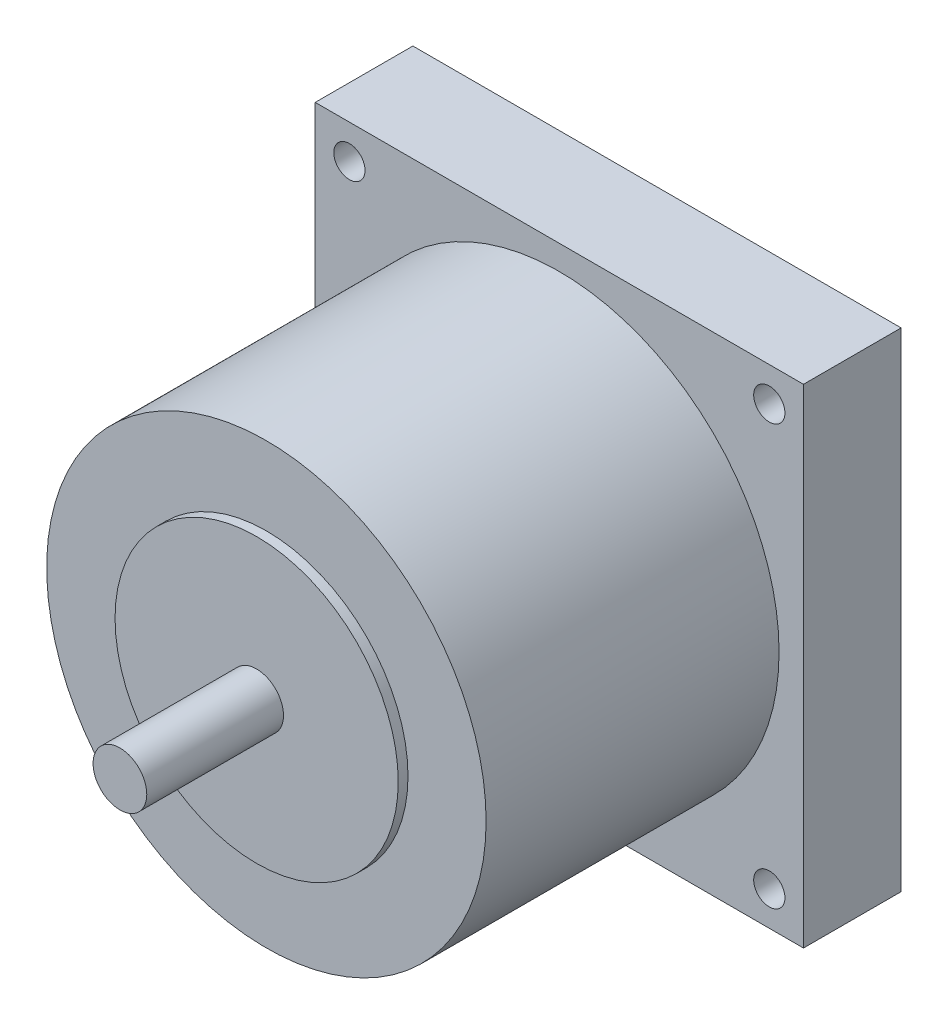
ISO-10303-21;
HEADER;
FILE_DESCRIPTION(('STEP AP214'),'2;1');
FILE_NAME('part.step','',(''),(''),'','','');
FILE_SCHEMA(('AUTOMOTIVE_DESIGN { 1 0 10303 214 1 1 1 1 }'));
ENDSEC;
DATA;
#1=APPLICATION_CONTEXT('core data for automotive mechanical design processes');
#2=APPLICATION_PROTOCOL_DEFINITION('international standard','automotive_design',2000,#1);
#3=PRODUCT_CONTEXT('',#1,'mechanical');
#4=PRODUCT('Part','Part','',(#3));
#5=PRODUCT_RELATED_PRODUCT_CATEGORY('part','',(#4));
#6=PRODUCT_DEFINITION_FORMATION('','',#4);
#7=PRODUCT_DEFINITION_CONTEXT('part definition',#1,'design');
#8=PRODUCT_DEFINITION('design','',#6,#7);
#9=PRODUCT_DEFINITION_SHAPE('','',#8);
#10=(LENGTH_UNIT() NAMED_UNIT(*) SI_UNIT(.MILLI.,.METRE.));
#11=(NAMED_UNIT(*) PLANE_ANGLE_UNIT() SI_UNIT($,.RADIAN.));
#12=(NAMED_UNIT(*) SI_UNIT($,.STERADIAN.) SOLID_ANGLE_UNIT());
#13=UNCERTAINTY_MEASURE_WITH_UNIT(LENGTH_MEASURE(1.E-05),#10,'distance_accuracy_value','');
#14=(GEOMETRIC_REPRESENTATION_CONTEXT(3) GLOBAL_UNCERTAINTY_ASSIGNED_CONTEXT((#13)) GLOBAL_UNIT_ASSIGNED_CONTEXT((#10,
#11,#12)) REPRESENTATION_CONTEXT('',''));
#15=CARTESIAN_POINT('',(0.,0.,0.));
#16=DIRECTION('',(0.,0.,1.));
#17=DIRECTION('',(1.,0.,0.));
#18=AXIS2_PLACEMENT_3D('',#15,#16,#17);
#19=CARTESIAN_POINT('',(0.,-25.,10.));
#20=DIRECTION('',(0.,1.,0.));
#21=DIRECTION('',(0.,0.,1.));
#22=AXIS2_PLACEMENT_3D('',#19,#20,#21);
#23=PLANE('',#22);
#24=DIRECTION('',(1.,0.,0.));
#25=VECTOR('',#24,1.);
#26=CARTESIAN_POINT('',(0.,-25.,0.));
#27=LINE('',#26,#25);
#28=CARTESIAN_POINT('',(-25.,-25.,0.));
#29=VERTEX_POINT('',#28);
#30=CARTESIAN_POINT('',(25.,-25.,0.));
#31=VERTEX_POINT('',#30);
#32=EDGE_CURVE('E113',#29,#31,#27,.T.);
#33=ORIENTED_EDGE('',*,*,#32,.T.);
#34=DIRECTION('',(0.,0.,-1.));
#35=VECTOR('',#34,1.);
#36=CARTESIAN_POINT('',(25.,-25.,10.));
#37=LINE('',#36,#35);
#38=CARTESIAN_POINT('',(25.,-25.,10.));
#39=VERTEX_POINT('',#38);
#40=EDGE_CURVE('E11',#39,#31,#37,.T.);
#41=ORIENTED_EDGE('',*,*,#40,.F.);
#42=DIRECTION('',(1.,0.,0.));
#43=VECTOR('',#42,1.);
#44=CARTESIAN_POINT('',(0.,-25.,10.));
#45=LINE('',#44,#43);
#46=CARTESIAN_POINT('',(-25.,-25.,10.));
#47=VERTEX_POINT('',#46);
#48=EDGE_CURVE('E96',#47,#39,#45,.T.);
#49=ORIENTED_EDGE('',*,*,#48,.F.);
#50=DIRECTION('',(0.,0.,-1.));
#51=VECTOR('',#50,1.);
#52=CARTESIAN_POINT('',(-25.,-25.,10.));
#53=LINE('',#52,#51);
#54=EDGE_CURVE('E64',#47,#29,#53,.T.);
#55=ORIENTED_EDGE('',*,*,#54,.T.);
#56=EDGE_LOOP('',(#33,#41,#49,#55));
#57=FACE_BOUND('',#56,.T.);
#58=ADVANCED_FACE('F44',(#57),#23,.F.);
#59=CARTESIAN_POINT('',(25.,0.,10.));
#60=DIRECTION('',(-1.,0.,0.));
#61=DIRECTION('',(0.,0.,1.));
#62=AXIS2_PLACEMENT_3D('',#59,#60,#61);
#63=PLANE('',#62);
#64=DIRECTION('',(0.,1.,0.));
#65=VECTOR('',#64,1.);
#66=CARTESIAN_POINT('',(25.,0.,0.));
#67=LINE('',#66,#65);
#68=CARTESIAN_POINT('',(25.,25.,0.));
#69=VERTEX_POINT('',#68);
#70=EDGE_CURVE('E105',#31,#69,#67,.T.);
#71=ORIENTED_EDGE('',*,*,#70,.T.);
#72=DIRECTION('',(0.,0.,-1.));
#73=VECTOR('',#72,1.);
#74=CARTESIAN_POINT('',(25.,25.,10.));
#75=LINE('',#74,#73);
#76=CARTESIAN_POINT('',(25.,25.,10.));
#77=VERTEX_POINT('',#76);
#78=EDGE_CURVE('E54',#77,#69,#75,.T.);
#79=ORIENTED_EDGE('',*,*,#78,.F.);
#80=DIRECTION('',(0.,1.,0.));
#81=VECTOR('',#80,1.);
#82=CARTESIAN_POINT('',(25.,0.,10.));
#83=LINE('',#82,#81);
#84=EDGE_CURVE('E86',#39,#77,#83,.T.);
#85=ORIENTED_EDGE('',*,*,#84,.F.);
#86=ORIENTED_EDGE('',*,*,#40,.T.);
#87=EDGE_LOOP('',(#71,#79,#85,#86));
#88=FACE_BOUND('',#87,.T.);
#89=ADVANCED_FACE('F101',(#88),#63,.F.);
#90=CARTESIAN_POINT('',(0.,25.,10.));
#91=DIRECTION('',(0.,1.,0.));
#92=DIRECTION('',(0.,0.,1.));
#93=AXIS2_PLACEMENT_3D('',#90,#91,#92);
#94=PLANE('',#93);
#95=DIRECTION('',(1.,0.,0.));
#96=VECTOR('',#95,1.);
#97=CARTESIAN_POINT('',(0.,25.,0.));
#98=LINE('',#97,#96);
#99=CARTESIAN_POINT('',(-25.,25.,0.));
#100=VERTEX_POINT('',#99);
#101=EDGE_CURVE('E123',#100,#69,#98,.T.);
#102=ORIENTED_EDGE('',*,*,#101,.F.);
#103=DIRECTION('',(0.,0.,-1.));
#104=VECTOR('',#103,1.);
#105=CARTESIAN_POINT('',(-25.,25.,10.));
#106=LINE('',#105,#104);
#107=CARTESIAN_POINT('',(-25.,25.,10.));
#108=VERTEX_POINT('',#107);
#109=EDGE_CURVE('E80',#108,#100,#106,.T.);
#110=ORIENTED_EDGE('',*,*,#109,.F.);
#111=DIRECTION('',(1.,0.,0.));
#112=VECTOR('',#111,1.);
#113=CARTESIAN_POINT('',(0.,25.,10.));
#114=LINE('',#113,#112);
#115=EDGE_CURVE('E92',#108,#77,#114,.T.);
#116=ORIENTED_EDGE('',*,*,#115,.T.);
#117=ORIENTED_EDGE('',*,*,#78,.T.);
#118=EDGE_LOOP('',(#102,#110,#116,#117));
#119=FACE_BOUND('',#118,.T.);
#120=ADVANCED_FACE('F110',(#119),#94,.T.);
#121=CARTESIAN_POINT('',(-25.,0.,10.));
#122=DIRECTION('',(-1.,0.,0.));
#123=DIRECTION('',(0.,0.,1.));
#124=AXIS2_PLACEMENT_3D('',#121,#122,#123);
#125=PLANE('',#124);
#126=DIRECTION('',(0.,1.,0.));
#127=VECTOR('',#126,1.);
#128=CARTESIAN_POINT('',(-25.,0.,0.));
#129=LINE('',#128,#127);
#130=EDGE_CURVE('E122',#29,#100,#129,.T.);
#131=ORIENTED_EDGE('',*,*,#130,.F.);
#132=ORIENTED_EDGE('',*,*,#54,.F.);
#133=DIRECTION('',(0.,1.,0.));
#134=VECTOR('',#133,1.);
#135=CARTESIAN_POINT('',(-25.,0.,10.));
#136=LINE('',#135,#134);
#137=EDGE_CURVE('E108',#47,#108,#136,.T.);
#138=ORIENTED_EDGE('',*,*,#137,.T.);
#139=ORIENTED_EDGE('',*,*,#109,.T.);
#140=EDGE_LOOP('',(#131,#132,#138,#139));
#141=FACE_BOUND('',#140,.T.);
#142=ADVANCED_FACE('F194',(#141),#125,.T.);
#143=CARTESIAN_POINT('',(0.,0.,10.));
#144=DIRECTION('',(0.,0.,1.));
#145=DIRECTION('',(1.,0.,0.));
#146=AXIS2_PLACEMENT_3D('',#143,#144,#145);
#147=PLANE('',#146);
#148=CARTESIAN_POINT('',(-21.5,21.5,10.));
#149=DIRECTION('',(0.,0.,1.));
#150=DIRECTION('',(1.,0.,0.));
#151=AXIS2_PLACEMENT_3D('',#148,#149,#150);
#152=CIRCLE('',#151,1.6);
#153=CARTESIAN_POINT('',(-19.9,21.5,10.));
#154=VERTEX_POINT('',#153);
#155=EDGE_CURVE('E153',#154,#154,#152,.T.);
#156=ORIENTED_EDGE('',*,*,#155,.F.);
#157=EDGE_LOOP('',(#156));
#158=FACE_BOUND('',#157,.T.);
#159=CARTESIAN_POINT('',(-21.5,-21.5,10.));
#160=DIRECTION('',(0.,0.,1.));
#161=DIRECTION('',(1.,0.,0.));
#162=AXIS2_PLACEMENT_3D('',#159,#160,#161);
#163=CIRCLE('',#162,1.6);
#164=CARTESIAN_POINT('',(-19.9,-21.5,10.));
#165=VERTEX_POINT('',#164);
#166=EDGE_CURVE('E160',#165,#165,#163,.T.);
#167=ORIENTED_EDGE('',*,*,#166,.F.);
#168=EDGE_LOOP('',(#167));
#169=FACE_BOUND('',#168,.T.);
#170=CARTESIAN_POINT('',(21.5,-21.5,10.));
#171=DIRECTION('',(0.,0.,1.));
#172=DIRECTION('',(1.,0.,0.));
#173=AXIS2_PLACEMENT_3D('',#170,#171,#172);
#174=CIRCLE('',#173,1.6);
#175=CARTESIAN_POINT('',(23.1,-21.5,10.));
#176=VERTEX_POINT('',#175);
#177=EDGE_CURVE('E161',#176,#176,#174,.T.);
#178=ORIENTED_EDGE('',*,*,#177,.F.);
#179=EDGE_LOOP('',(#178));
#180=FACE_BOUND('',#179,.T.);
#181=CARTESIAN_POINT('',(21.5,21.5,10.));
#182=DIRECTION('',(0.,0.,1.));
#183=DIRECTION('',(1.,0.,0.));
#184=AXIS2_PLACEMENT_3D('',#181,#182,#183);
#185=CIRCLE('',#184,1.6);
#186=CARTESIAN_POINT('',(23.1,21.5,10.));
#187=VERTEX_POINT('',#186);
#188=EDGE_CURVE('E164',#187,#187,#185,.T.);
#189=ORIENTED_EDGE('',*,*,#188,.F.);
#190=EDGE_LOOP('',(#189));
#191=FACE_BOUND('',#190,.T.);
#192=CARTESIAN_POINT('',(0.,0.,10.));
#193=DIRECTION('',(0.,0.,1.));
#194=DIRECTION('',(1.,0.,0.));
#195=AXIS2_PLACEMENT_3D('',#192,#193,#194);
#196=CIRCLE('',#195,22.5);
#197=CARTESIAN_POINT('',(22.5,0.,10.));
#198=VERTEX_POINT('',#197);
#199=EDGE_CURVE('E119',#198,#198,#196,.F.);
#200=ORIENTED_EDGE('',*,*,#199,.T.);
#201=EDGE_LOOP('',(#200));
#202=FACE_BOUND('',#201,.T.);
#203=ORIENTED_EDGE('',*,*,#48,.T.);
#204=ORIENTED_EDGE('',*,*,#84,.T.);
#205=ORIENTED_EDGE('',*,*,#115,.F.);
#206=ORIENTED_EDGE('',*,*,#137,.F.);
#207=EDGE_LOOP('',(#203,#204,#205,#206));
#208=FACE_BOUND('',#207,.T.);
#209=ADVANCED_FACE('F95',(#158,#169,#180,#191,#202,#208),#147,.T.);
#210=CARTESIAN_POINT('',(0.,0.,0.));
#211=DIRECTION('',(0.,0.,1.));
#212=DIRECTION('',(1.,0.,0.));
#213=AXIS2_PLACEMENT_3D('',#210,#211,#212);
#214=PLANE('',#213);
#215=CARTESIAN_POINT('',(-21.5,21.5,0.));
#216=DIRECTION('',(0.,0.,-1.));
#217=DIRECTION('',(1.,0.,0.));
#218=AXIS2_PLACEMENT_3D('',#215,#216,#217);
#219=CIRCLE('',#218,1.6);
#220=CARTESIAN_POINT('',(-19.9,21.5,0.));
#221=VERTEX_POINT('',#220);
#222=EDGE_CURVE('E171',#221,#221,#219,.T.);
#223=ORIENTED_EDGE('',*,*,#222,.F.);
#224=EDGE_LOOP('',(#223));
#225=FACE_BOUND('',#224,.T.);
#226=CARTESIAN_POINT('',(-21.5,-21.5,0.));
#227=DIRECTION('',(0.,0.,-1.));
#228=DIRECTION('',(-1.,0.,0.));
#229=AXIS2_PLACEMENT_3D('',#226,#227,#228);
#230=CIRCLE('',#229,1.6);
#231=CARTESIAN_POINT('',(-23.1,-21.5,0.));
#232=VERTEX_POINT('',#231);
#233=EDGE_CURVE('E176',#232,#232,#230,.T.);
#234=ORIENTED_EDGE('',*,*,#233,.F.);
#235=EDGE_LOOP('',(#234));
#236=FACE_BOUND('',#235,.T.);
#237=CARTESIAN_POINT('',(21.5,-21.5,0.));
#238=DIRECTION('',(0.,0.,-1.));
#239=DIRECTION('',(1.,0.,0.));
#240=AXIS2_PLACEMENT_3D('',#237,#238,#239);
#241=CIRCLE('',#240,1.6);
#242=CARTESIAN_POINT('',(23.1,-21.5,0.));
#243=VERTEX_POINT('',#242);
#244=EDGE_CURVE('E174',#243,#243,#241,.T.);
#245=ORIENTED_EDGE('',*,*,#244,.F.);
#246=EDGE_LOOP('',(#245));
#247=FACE_BOUND('',#246,.T.);
#248=CARTESIAN_POINT('',(21.5,21.5,0.));
#249=DIRECTION('',(0.,0.,-1.));
#250=DIRECTION('',(-1.,0.,0.));
#251=AXIS2_PLACEMENT_3D('',#248,#249,#250);
#252=CIRCLE('',#251,1.6);
#253=CARTESIAN_POINT('',(19.9,21.5,0.));
#254=VERTEX_POINT('',#253);
#255=EDGE_CURVE('E166',#254,#254,#252,.T.);
#256=ORIENTED_EDGE('',*,*,#255,.F.);
#257=EDGE_LOOP('',(#256));
#258=FACE_BOUND('',#257,.T.);
#259=ORIENTED_EDGE('',*,*,#32,.F.);
#260=ORIENTED_EDGE('',*,*,#130,.T.);
#261=ORIENTED_EDGE('',*,*,#101,.T.);
#262=ORIENTED_EDGE('',*,*,#70,.F.);
#263=EDGE_LOOP('',(#259,#260,#261,#262));
#264=FACE_BOUND('',#263,.T.);
#265=ADVANCED_FACE('F189',(#225,#236,#247,#258,#264),#214,.F.);
#266=CARTESIAN_POINT('',(0.,0.,40.));
#267=DIRECTION('',(0.,0.,-1.));
#268=DIRECTION('',(-1.,0.,0.));
#269=AXIS2_PLACEMENT_3D('',#266,#267,#268);
#270=CYLINDRICAL_SURFACE('',#269,22.5);
#271=ORIENTED_EDGE('',*,*,#199,.F.);
#272=EDGE_LOOP('',(#271));
#273=FACE_BOUND('',#272,.T.);
#274=CARTESIAN_POINT('',(0.,0.,40.));
#275=DIRECTION('',(0.,0.,1.));
#276=DIRECTION('',(1.,0.,0.));
#277=AXIS2_PLACEMENT_3D('',#274,#275,#276);
#278=CIRCLE('',#277,22.5);
#279=CARTESIAN_POINT('',(22.5,0.,40.));
#280=VERTEX_POINT('',#279);
#281=EDGE_CURVE('E140',#280,#280,#278,.T.);
#282=ORIENTED_EDGE('',*,*,#281,.F.);
#283=EDGE_LOOP('',(#282));
#284=FACE_BOUND('',#283,.T.);
#285=ADVANCED_FACE('F193',(#273,#284),#270,.T.);
#286=CARTESIAN_POINT('',(0.,0.,40.));
#287=DIRECTION('',(0.,0.,1.));
#288=DIRECTION('',(1.,0.,0.));
#289=AXIS2_PLACEMENT_3D('',#286,#287,#288);
#290=PLANE('',#289);
#291=CARTESIAN_POINT('',(0.,0.,40.));
#292=DIRECTION('',(0.,0.,1.));
#293=DIRECTION('',(1.,0.,0.));
#294=AXIS2_PLACEMENT_3D('',#291,#292,#293);
#295=CIRCLE('',#294,14.5);
#296=CARTESIAN_POINT('',(14.5,0.,40.));
#297=VERTEX_POINT('',#296);
#298=EDGE_CURVE('E48',#297,#297,#295,.F.);
#299=ORIENTED_EDGE('',*,*,#298,.T.);
#300=EDGE_LOOP('',(#299));
#301=FACE_BOUND('',#300,.T.);
#302=ORIENTED_EDGE('',*,*,#281,.T.);
#303=EDGE_LOOP('',(#302));
#304=FACE_BOUND('',#303,.T.);
#305=ADVANCED_FACE('F241',(#301,#304),#290,.T.);
#306=CARTESIAN_POINT('',(0.,0.,41.));
#307=DIRECTION('',(0.,0.,-1.));
#308=DIRECTION('',(-1.,0.,0.));
#309=AXIS2_PLACEMENT_3D('',#306,#307,#308);
#310=CYLINDRICAL_SURFACE('',#309,14.5);
#311=ORIENTED_EDGE('',*,*,#298,.F.);
#312=EDGE_LOOP('',(#311));
#313=FACE_BOUND('',#312,.T.);
#314=CARTESIAN_POINT('',(0.,0.,41.));
#315=DIRECTION('',(0.,0.,1.));
#316=DIRECTION('',(1.,0.,0.));
#317=AXIS2_PLACEMENT_3D('',#314,#315,#316);
#318=CIRCLE('',#317,14.5);
#319=CARTESIAN_POINT('',(14.5,0.,41.));
#320=VERTEX_POINT('',#319);
#321=EDGE_CURVE('E143',#320,#320,#318,.T.);
#322=ORIENTED_EDGE('',*,*,#321,.F.);
#323=EDGE_LOOP('',(#322));
#324=FACE_BOUND('',#323,.T.);
#325=ADVANCED_FACE('F255',(#313,#324),#310,.T.);
#326=CARTESIAN_POINT('',(0.,0.,41.));
#327=DIRECTION('',(0.,0.,1.));
#328=DIRECTION('',(1.,0.,0.));
#329=AXIS2_PLACEMENT_3D('',#326,#327,#328);
#330=PLANE('',#329);
#331=CARTESIAN_POINT('',(0.,0.,41.));
#332=DIRECTION('',(0.,0.,1.));
#333=DIRECTION('',(1.,0.,0.));
#334=AXIS2_PLACEMENT_3D('',#331,#332,#333);
#335=CIRCLE('',#334,2.75);
#336=CARTESIAN_POINT('',(2.75,0.,41.));
#337=VERTEX_POINT('',#336);
#338=EDGE_CURVE('E144',#337,#337,#335,.T.);
#339=ORIENTED_EDGE('',*,*,#338,.F.);
#340=EDGE_LOOP('',(#339));
#341=FACE_BOUND('',#340,.T.);
#342=ORIENTED_EDGE('',*,*,#321,.T.);
#343=EDGE_LOOP('',(#342));
#344=FACE_BOUND('',#343,.T.);
#345=ADVANCED_FACE('F262',(#341,#344),#330,.T.);
#346=CARTESIAN_POINT('',(0.,0.,55.));
#347=DIRECTION('',(0.,0.,-1.));
#348=DIRECTION('',(-1.,0.,0.));
#349=AXIS2_PLACEMENT_3D('',#346,#347,#348);
#350=CYLINDRICAL_SURFACE('',#349,2.75);
#351=ORIENTED_EDGE('',*,*,#338,.T.);
#352=EDGE_LOOP('',(#351));
#353=FACE_BOUND('',#352,.T.);
#354=CARTESIAN_POINT('',(0.,0.,55.));
#355=DIRECTION('',(0.,0.,1.));
#356=DIRECTION('',(1.,0.,0.));
#357=AXIS2_PLACEMENT_3D('',#354,#355,#356);
#358=CIRCLE('',#357,2.75);
#359=CARTESIAN_POINT('',(2.75,0.,55.));
#360=VERTEX_POINT('',#359);
#361=EDGE_CURVE('E149',#360,#360,#358,.T.);
#362=ORIENTED_EDGE('',*,*,#361,.F.);
#363=EDGE_LOOP('',(#362));
#364=FACE_BOUND('',#363,.T.);
#365=ADVANCED_FACE('F273',(#353,#364),#350,.T.);
#366=CARTESIAN_POINT('',(0.,0.,55.));
#367=DIRECTION('',(0.,0.,1.));
#368=DIRECTION('',(1.,0.,0.));
#369=AXIS2_PLACEMENT_3D('',#366,#367,#368);
#370=PLANE('',#369);
#371=ORIENTED_EDGE('',*,*,#361,.T.);
#372=EDGE_LOOP('',(#371));
#373=FACE_BOUND('',#372,.T.);
#374=ADVANCED_FACE('F281',(#373),#370,.T.);
#375=CARTESIAN_POINT('',(21.5,21.5,55.));
#376=DIRECTION('',(0.,0.,-1.));
#377=DIRECTION('',(-1.,0.,0.));
#378=AXIS2_PLACEMENT_3D('',#375,#376,#377);
#379=CYLINDRICAL_SURFACE('',#378,1.6);
#380=ORIENTED_EDGE('',*,*,#188,.T.);
#381=EDGE_LOOP('',(#380));
#382=FACE_BOUND('',#381,.T.);
#383=ORIENTED_EDGE('',*,*,#255,.T.);
#384=EDGE_LOOP('',(#383));
#385=FACE_BOUND('',#384,.T.);
#386=ADVANCED_FACE('F291',(#382,#385),#379,.F.);
#387=CARTESIAN_POINT('',(21.5,-21.5,55.));
#388=DIRECTION('',(0.,0.,-1.));
#389=DIRECTION('',(-1.,0.,0.));
#390=AXIS2_PLACEMENT_3D('',#387,#388,#389);
#391=CYLINDRICAL_SURFACE('',#390,1.6);
#392=ORIENTED_EDGE('',*,*,#177,.T.);
#393=EDGE_LOOP('',(#392));
#394=FACE_BOUND('',#393,.T.);
#395=ORIENTED_EDGE('',*,*,#244,.T.);
#396=EDGE_LOOP('',(#395));
#397=FACE_BOUND('',#396,.T.);
#398=ADVANCED_FACE('F187',(#394,#397),#391,.F.);
#399=CARTESIAN_POINT('',(-21.5,-21.5,55.));
#400=DIRECTION('',(0.,0.,-1.));
#401=DIRECTION('',(-1.,0.,0.));
#402=AXIS2_PLACEMENT_3D('',#399,#400,#401);
#403=CYLINDRICAL_SURFACE('',#402,1.6);
#404=ORIENTED_EDGE('',*,*,#166,.T.);
#405=EDGE_LOOP('',(#404));
#406=FACE_BOUND('',#405,.T.);
#407=ORIENTED_EDGE('',*,*,#233,.T.);
#408=EDGE_LOOP('',(#407));
#409=FACE_BOUND('',#408,.T.);
#410=ADVANCED_FACE('F313',(#406,#409),#403,.F.);
#411=CARTESIAN_POINT('',(-21.5,21.5,55.));
#412=DIRECTION('',(0.,0.,-1.));
#413=DIRECTION('',(-1.,0.,0.));
#414=AXIS2_PLACEMENT_3D('',#411,#412,#413);
#415=CYLINDRICAL_SURFACE('',#414,1.6);
#416=ORIENTED_EDGE('',*,*,#155,.T.);
#417=EDGE_LOOP('',(#416));
#418=FACE_BOUND('',#417,.T.);
#419=ORIENTED_EDGE('',*,*,#222,.T.);
#420=EDGE_LOOP('',(#419));
#421=FACE_BOUND('',#420,.T.);
#422=ADVANCED_FACE('F321',(#418,#421),#415,.F.);
#423=CLOSED_SHELL('',(#58,#89,#120,#142,#209,#265,#285,#305,#325,#345,#365,#374,#386,#398,#410,#422));
#424=MANIFOLD_SOLID_BREP('B2',#423);
#425=ADVANCED_BREP_SHAPE_REPRESENTATION('',(#18,#424),#14);
#426=SHAPE_DEFINITION_REPRESENTATION(#9,#425);
ENDSEC;
END-ISO-10303-21;
